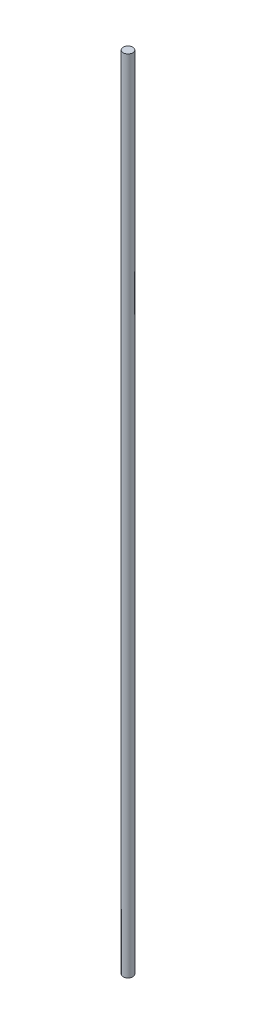
ISO-10303-21;
HEADER;
FILE_DESCRIPTION(('STEP AP214'),'2;1');
FILE_NAME('part.step','',(''),(''),'','','');
FILE_SCHEMA(('AUTOMOTIVE_DESIGN { 1 0 10303 214 1 1 1 1 }'));
ENDSEC;
DATA;
#1=APPLICATION_CONTEXT('core data for automotive mechanical design processes');
#2=APPLICATION_PROTOCOL_DEFINITION('international standard','automotive_design',2000,#1);
#3=PRODUCT_CONTEXT('',#1,'mechanical');
#4=PRODUCT('Part','Part','',(#3));
#5=PRODUCT_RELATED_PRODUCT_CATEGORY('part','',(#4));
#6=PRODUCT_DEFINITION_FORMATION('','',#4);
#7=PRODUCT_DEFINITION_CONTEXT('part definition',#1,'design');
#8=PRODUCT_DEFINITION('design','',#6,#7);
#9=PRODUCT_DEFINITION_SHAPE('','',#8);
#10=(LENGTH_UNIT() NAMED_UNIT(*) SI_UNIT(.MILLI.,.METRE.));
#11=(NAMED_UNIT(*) PLANE_ANGLE_UNIT() SI_UNIT($,.RADIAN.));
#12=(NAMED_UNIT(*) SI_UNIT($,.STERADIAN.) SOLID_ANGLE_UNIT());
#13=UNCERTAINTY_MEASURE_WITH_UNIT(LENGTH_MEASURE(1.E-05),#10,'distance_accuracy_value','');
#14=(GEOMETRIC_REPRESENTATION_CONTEXT(3) GLOBAL_UNCERTAINTY_ASSIGNED_CONTEXT((#13)) GLOBAL_UNIT_ASSIGNED_CONTEXT((#10,
#11,#12)) REPRESENTATION_CONTEXT('',''));
#15=CARTESIAN_POINT('',(0.,0.,0.));
#16=DIRECTION('',(0.,0.,1.));
#17=DIRECTION('',(1.,0.,0.));
#18=AXIS2_PLACEMENT_3D('',#15,#16,#17);
#19=CARTESIAN_POINT('',(0.,492.494769147868,-3.));
#20=DIRECTION('',(0.,1.,0.));
#21=DIRECTION('',(0.,0.,1.));
#22=AXIS2_PLACEMENT_3D('',#19,#20,#21);
#23=CYLINDRICAL_SURFACE('',#22,3.00000000000003);
#24=CARTESIAN_POINT('',(0.,-2.50523085213195,-3.));
#25=DIRECTION('',(0.,1.,0.));
#26=DIRECTION('',(0.,0.,1.));
#27=AXIS2_PLACEMENT_3D('',#24,#25,#26);
#28=CIRCLE('',#27,3.);
#29=CARTESIAN_POINT('',(0.,-2.50523085213195,0.));
#30=VERTEX_POINT('',#29);
#31=EDGE_CURVE('E43',#30,#30,#28,.T.);
#32=ORIENTED_EDGE('',*,*,#31,.T.);
#33=EDGE_LOOP('',(#32));
#34=FACE_BOUND('',#33,.T.);
#35=CARTESIAN_POINT('',(0.,492.494769147868,-3.));
#36=DIRECTION('',(0.,1.,0.));
#37=DIRECTION('',(0.,0.,1.));
#38=AXIS2_PLACEMENT_3D('',#35,#36,#37);
#39=CIRCLE('',#38,3.00000000000005);
#40=CARTESIAN_POINT('',(0.,492.494769147868,0.));
#41=VERTEX_POINT('',#40);
#42=EDGE_CURVE('E10',#41,#41,#39,.T.);
#43=ORIENTED_EDGE('',*,*,#42,.F.);
#44=EDGE_LOOP('',(#43));
#45=FACE_BOUND('',#44,.T.);
#46=ADVANCED_FACE('F37',(#34,#45),#23,.T.);
#47=CARTESIAN_POINT('',(0.,492.494769147868,0.));
#48=DIRECTION('',(0.,1.,0.));
#49=DIRECTION('',(0.,0.,1.));
#50=AXIS2_PLACEMENT_3D('',#47,#48,#49);
#51=PLANE('',#50);
#52=ORIENTED_EDGE('',*,*,#42,.T.);
#53=EDGE_LOOP('',(#52));
#54=FACE_BOUND('',#53,.T.);
#55=ADVANCED_FACE('F53',(#54),#51,.T.);
#56=CARTESIAN_POINT('',(0.,-2.50523085213193,-3.));
#57=DIRECTION('',(0.,-1.,0.));
#58=DIRECTION('',(0.,0.,-1.));
#59=AXIS2_PLACEMENT_3D('',#56,#57,#58);
#60=PLANE('',#59);
#61=ORIENTED_EDGE('',*,*,#31,.F.);
#62=EDGE_LOOP('',(#61));
#63=FACE_BOUND('',#62,.T.);
#64=ADVANCED_FACE('F51',(#63),#60,.T.);
#65=CLOSED_SHELL('',(#46,#55,#64));
#66=MANIFOLD_SOLID_BREP('B2',#65);
#67=ADVANCED_BREP_SHAPE_REPRESENTATION('',(#18,#66),#14);
#68=SHAPE_DEFINITION_REPRESENTATION(#9,#67);
ENDSEC;
END-ISO-10303-21;
